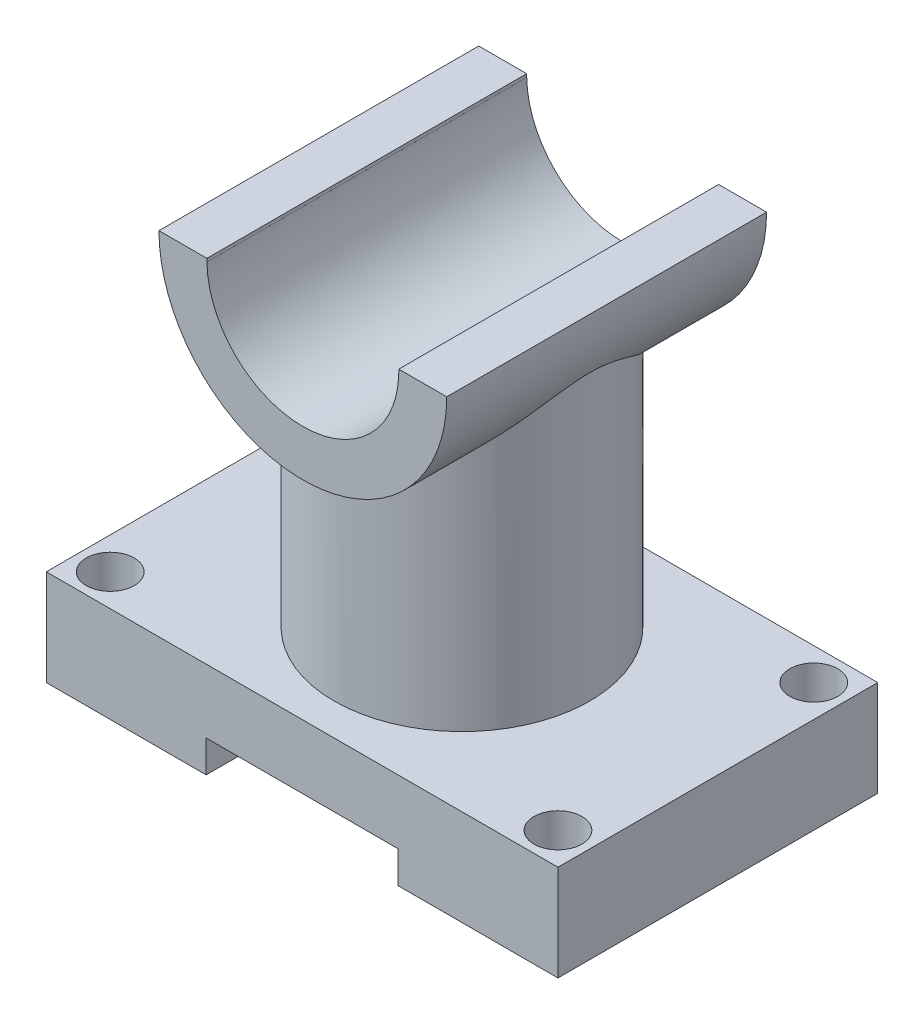
ISO-10303-21;
HEADER;
FILE_DESCRIPTION(('STEP AP214'),'2;1');
FILE_NAME('part.step','',(''),(''),'','','');
FILE_SCHEMA(('AUTOMOTIVE_DESIGN { 1 0 10303 214 1 1 1 1 }'));
ENDSEC;
DATA;
#1=APPLICATION_CONTEXT('core data for automotive mechanical design processes');
#2=APPLICATION_PROTOCOL_DEFINITION('international standard','automotive_design',2000,#1);
#3=PRODUCT_CONTEXT('',#1,'mechanical');
#4=PRODUCT('Part','Part','',(#3));
#5=PRODUCT_RELATED_PRODUCT_CATEGORY('part','',(#4));
#6=PRODUCT_DEFINITION_FORMATION('','',#4);
#7=PRODUCT_DEFINITION_CONTEXT('part definition',#1,'design');
#8=PRODUCT_DEFINITION('design','',#6,#7);
#9=PRODUCT_DEFINITION_SHAPE('','',#8);
#10=(LENGTH_UNIT() NAMED_UNIT(*) SI_UNIT(.MILLI.,.METRE.));
#11=(NAMED_UNIT(*) PLANE_ANGLE_UNIT() SI_UNIT($,.RADIAN.));
#12=(NAMED_UNIT(*) SI_UNIT($,.STERADIAN.) SOLID_ANGLE_UNIT());
#13=UNCERTAINTY_MEASURE_WITH_UNIT(LENGTH_MEASURE(1.E-05),#10,'distance_accuracy_value','');
#14=(GEOMETRIC_REPRESENTATION_CONTEXT(3) GLOBAL_UNCERTAINTY_ASSIGNED_CONTEXT((#13)) GLOBAL_UNIT_ASSIGNED_CONTEXT((#10,
#11,#12)) REPRESENTATION_CONTEXT('',''));
#15=CARTESIAN_POINT('',(0.,0.,0.));
#16=DIRECTION('',(0.,0.,1.));
#17=DIRECTION('',(1.,0.,0.));
#18=AXIS2_PLACEMENT_3D('',#15,#16,#17);
#19=CARTESIAN_POINT('',(87.1453590192644,-30.,-100.));
#20=DIRECTION('',(0.,0.,-1.));
#21=DIRECTION('',(-1.,0.,0.));
#22=AXIS2_PLACEMENT_3D('',#19,#20,#21);
#23=PLANE('',#22);
#24=DIRECTION('',(-1.,0.,0.));
#25=VECTOR('',#24,1.);
#26=CARTESIAN_POINT('',(87.1453590192644,-30.,-100.));
#27=LINE('',#26,#25);
#28=CARTESIAN_POINT('',(87.1453590192644,-30.,-100.));
#29=VERTEX_POINT('',#28);
#30=CARTESIAN_POINT('',(37.1453590192644,-30.,-100.));
#31=VERTEX_POINT('',#30);
#32=EDGE_CURVE('E180',#29,#31,#27,.T.);
#33=ORIENTED_EDGE('',*,*,#32,.T.);
#34=DIRECTION('',(0.,-1.,0.));
#35=VECTOR('',#34,1.);
#36=CARTESIAN_POINT('',(37.1453590192644,0.,-100.));
#37=LINE('',#36,#35);
#38=CARTESIAN_POINT('',(37.1453590192644,-20.,-100.));
#39=VERTEX_POINT('',#38);
#40=EDGE_CURVE('E169',#39,#31,#37,.T.);
#41=ORIENTED_EDGE('',*,*,#40,.F.);
#42=DIRECTION('',(1.,0.,0.));
#43=VECTOR('',#42,1.);
#44=CARTESIAN_POINT('',(0.,-20.,-100.));
#45=LINE('',#44,#43);
#46=CARTESIAN_POINT('',(-22.8546409807356,-20.,-100.));
#47=VERTEX_POINT('',#46);
#48=EDGE_CURVE('E158',#47,#39,#45,.T.);
#49=ORIENTED_EDGE('',*,*,#48,.F.);
#50=DIRECTION('',(0.,1.,0.));
#51=VECTOR('',#50,1.);
#52=CARTESIAN_POINT('',(-22.8546409807356,0.,-100.));
#53=LINE('',#52,#51);
#54=CARTESIAN_POINT('',(-22.8546409807356,-30.,-100.));
#55=VERTEX_POINT('',#54);
#56=EDGE_CURVE('E168',#55,#47,#53,.T.);
#57=ORIENTED_EDGE('',*,*,#56,.F.);
#58=CARTESIAN_POINT('',(-72.8546409807356,-30.,-100.));
#59=VERTEX_POINT('',#58);
#60=EDGE_CURVE('E260',#55,#59,#27,.T.);
#61=ORIENTED_EDGE('',*,*,#60,.T.);
#62=DIRECTION('',(0.,1.,0.));
#63=VECTOR('',#62,1.);
#64=CARTESIAN_POINT('',(-72.8546409807356,-30.,-100.));
#65=LINE('',#64,#63);
#66=CARTESIAN_POINT('',(-72.8546409807356,0.,-100.));
#67=VERTEX_POINT('',#66);
#68=EDGE_CURVE('E51',#59,#67,#65,.T.);
#69=ORIENTED_EDGE('',*,*,#68,.T.);
#70=DIRECTION('',(-1.,0.,0.));
#71=VECTOR('',#70,1.);
#72=CARTESIAN_POINT('',(87.1453590192644,0.,-100.));
#73=LINE('',#72,#71);
#74=CARTESIAN_POINT('',(87.1453590192644,0.,-100.));
#75=VERTEX_POINT('',#74);
#76=EDGE_CURVE('E253',#75,#67,#73,.T.);
#77=ORIENTED_EDGE('',*,*,#76,.F.);
#78=DIRECTION('',(0.,1.,0.));
#79=VECTOR('',#78,1.);
#80=CARTESIAN_POINT('',(87.1453590192644,-30.,-100.));
#81=LINE('',#80,#79);
#82=EDGE_CURVE('E275',#29,#75,#81,.T.);
#83=ORIENTED_EDGE('',*,*,#82,.F.);
#84=EDGE_LOOP('',(#33,#41,#49,#57,#61,#69,#77,#83));
#85=FACE_BOUND('',#84,.T.);
#86=ADVANCED_FACE('F37',(#85),#23,.T.);
#87=CARTESIAN_POINT('',(-72.8546409807356,-30.,0.));
#88=DIRECTION('',(0.,0.,1.));
#89=DIRECTION('',(1.,0.,0.));
#90=AXIS2_PLACEMENT_3D('',#87,#88,#89);
#91=PLANE('',#90);
#92=DIRECTION('',(1.,0.,0.));
#93=VECTOR('',#92,1.);
#94=CARTESIAN_POINT('',(0.,-20.,0.));
#95=LINE('',#94,#93);
#96=CARTESIAN_POINT('',(-22.8546409807356,-20.,0.));
#97=VERTEX_POINT('',#96);
#98=CARTESIAN_POINT('',(37.1453590192644,-20.,0.));
#99=VERTEX_POINT('',#98);
#100=EDGE_CURVE('E182',#97,#99,#95,.T.);
#101=ORIENTED_EDGE('',*,*,#100,.T.);
#102=DIRECTION('',(0.,-1.,0.));
#103=VECTOR('',#102,1.);
#104=CARTESIAN_POINT('',(37.1453590192644,0.,0.));
#105=LINE('',#104,#103);
#106=CARTESIAN_POINT('',(37.1453590192644,-30.,0.));
#107=VERTEX_POINT('',#106);
#108=EDGE_CURVE('E175',#99,#107,#105,.T.);
#109=ORIENTED_EDGE('',*,*,#108,.T.);
#110=DIRECTION('',(1.,0.,0.));
#111=VECTOR('',#110,1.);
#112=CARTESIAN_POINT('',(-72.8546409807356,-30.,0.));
#113=LINE('',#112,#111);
#114=CARTESIAN_POINT('',(87.1453590192644,-30.,0.));
#115=VERTEX_POINT('',#114);
#116=EDGE_CURVE('E252',#107,#115,#113,.T.);
#117=ORIENTED_EDGE('',*,*,#116,.T.);
#118=DIRECTION('',(0.,1.,0.));
#119=VECTOR('',#118,1.);
#120=CARTESIAN_POINT('',(87.1453590192644,-30.,0.));
#121=LINE('',#120,#119);
#122=CARTESIAN_POINT('',(87.1453590192644,0.,0.));
#123=VERTEX_POINT('',#122);
#124=EDGE_CURVE('E277',#115,#123,#121,.T.);
#125=ORIENTED_EDGE('',*,*,#124,.T.);
#126=DIRECTION('',(1.,0.,0.));
#127=VECTOR('',#126,1.);
#128=CARTESIAN_POINT('',(-72.8546409807356,0.,0.));
#129=LINE('',#128,#127);
#130=CARTESIAN_POINT('',(-72.8546409807356,0.,0.));
#131=VERTEX_POINT('',#130);
#132=EDGE_CURVE('E266',#131,#123,#129,.T.);
#133=ORIENTED_EDGE('',*,*,#132,.F.);
#134=DIRECTION('',(0.,1.,0.));
#135=VECTOR('',#134,1.);
#136=CARTESIAN_POINT('',(-72.8546409807356,-30.,0.));
#137=LINE('',#136,#135);
#138=CARTESIAN_POINT('',(-72.8546409807356,-30.,0.));
#139=VERTEX_POINT('',#138);
#140=EDGE_CURVE('E262',#139,#131,#137,.T.);
#141=ORIENTED_EDGE('',*,*,#140,.F.);
#142=CARTESIAN_POINT('',(-22.8546409807356,-30.,0.));
#143=VERTEX_POINT('',#142);
#144=EDGE_CURVE('E254',#139,#143,#113,.T.);
#145=ORIENTED_EDGE('',*,*,#144,.T.);
#146=DIRECTION('',(0.,1.,0.));
#147=VECTOR('',#146,1.);
#148=CARTESIAN_POINT('',(-22.8546409807356,0.,0.));
#149=LINE('',#148,#147);
#150=EDGE_CURVE('E59',#143,#97,#149,.T.);
#151=ORIENTED_EDGE('',*,*,#150,.T.);
#152=EDGE_LOOP('',(#101,#109,#117,#125,#133,#141,#145,#151));
#153=FACE_BOUND('',#152,.T.);
#154=ADVANCED_FACE('F285',(#153),#91,.T.);
#155=CARTESIAN_POINT('',(0.,-30.,0.));
#156=DIRECTION('',(0.,1.,0.));
#157=DIRECTION('',(0.,0.,1.));
#158=AXIS2_PLACEMENT_3D('',#155,#156,#157);
#159=PLANE('',#158);
#160=CARTESIAN_POINT('',(77.1453590192644,-30.,-10.));
#161=DIRECTION('',(0.,1.,0.));
#162=DIRECTION('',(0.,0.,1.));
#163=AXIS2_PLACEMENT_3D('',#160,#161,#162);
#164=CIRCLE('',#163,7.50000000000001);
#165=CARTESIAN_POINT('',(77.1453590192644,-30.,-2.49999999999999));
#166=VERTEX_POINT('',#165);
#167=EDGE_CURVE('E185',#166,#166,#164,.T.);
#168=ORIENTED_EDGE('',*,*,#167,.T.);
#169=EDGE_LOOP('',(#168));
#170=FACE_BOUND('',#169,.T.);
#171=CARTESIAN_POINT('',(77.1453590192644,-30.,-90.));
#172=DIRECTION('',(0.,1.,0.));
#173=DIRECTION('',(0.,0.,1.));
#174=AXIS2_PLACEMENT_3D('',#171,#172,#173);
#175=CIRCLE('',#174,7.50000000000001);
#176=CARTESIAN_POINT('',(77.1453590192644,-30.,-82.5));
#177=VERTEX_POINT('',#176);
#178=EDGE_CURVE('E387',#177,#177,#175,.T.);
#179=ORIENTED_EDGE('',*,*,#178,.T.);
#180=EDGE_LOOP('',(#179));
#181=FACE_BOUND('',#180,.T.);
#182=DIRECTION('',(0.,0.,1.));
#183=VECTOR('',#182,1.);
#184=CARTESIAN_POINT('',(37.1453590192644,-30.,-100.));
#185=LINE('',#184,#183);
#186=EDGE_CURVE('E191',#31,#107,#185,.T.);
#187=ORIENTED_EDGE('',*,*,#186,.F.);
#188=ORIENTED_EDGE('',*,*,#32,.F.);
#189=DIRECTION('',(0.,0.,-1.));
#190=VECTOR('',#189,1.);
#191=CARTESIAN_POINT('',(87.1453590192644,-30.,0.));
#192=LINE('',#191,#190);
#193=EDGE_CURVE('E257',#115,#29,#192,.T.);
#194=ORIENTED_EDGE('',*,*,#193,.F.);
#195=ORIENTED_EDGE('',*,*,#116,.F.);
#196=EDGE_LOOP('',(#187,#188,#194,#195));
#197=FACE_BOUND('',#196,.T.);
#198=ADVANCED_FACE('F297',(#170,#181,#197),#159,.F.);
#199=CARTESIAN_POINT('',(-62.8546409807356,-30.,-9.99999999999999));
#200=DIRECTION('',(0.,1.,0.));
#201=DIRECTION('',(0.,0.,1.));
#202=AXIS2_PLACEMENT_3D('',#199,#200,#201);
#203=CIRCLE('',#202,7.5);
#204=CARTESIAN_POINT('',(-62.8546409807356,-30.,-2.5));
#205=VERTEX_POINT('',#204);
#206=EDGE_CURVE('E386',#205,#205,#203,.T.);
#207=ORIENTED_EDGE('',*,*,#206,.T.);
#208=EDGE_LOOP('',(#207));
#209=FACE_BOUND('',#208,.T.);
#210=CARTESIAN_POINT('',(-62.8546409807356,-30.,-90.));
#211=DIRECTION('',(0.,1.,0.));
#212=DIRECTION('',(0.,0.,1.));
#213=AXIS2_PLACEMENT_3D('',#210,#211,#212);
#214=CIRCLE('',#213,7.5);
#215=CARTESIAN_POINT('',(-62.8546409807356,-30.,-82.5));
#216=VERTEX_POINT('',#215);
#217=EDGE_CURVE('E384',#216,#216,#214,.T.);
#218=ORIENTED_EDGE('',*,*,#217,.T.);
#219=EDGE_LOOP('',(#218));
#220=FACE_BOUND('',#219,.T.);
#221=DIRECTION('',(0.,0.,1.));
#222=VECTOR('',#221,1.);
#223=CARTESIAN_POINT('',(-22.8546409807356,-30.,-100.));
#224=LINE('',#223,#222);
#225=EDGE_CURVE('E194',#55,#143,#224,.T.);
#226=ORIENTED_EDGE('',*,*,#225,.T.);
#227=ORIENTED_EDGE('',*,*,#144,.F.);
#228=DIRECTION('',(0.,0.,1.));
#229=VECTOR('',#228,1.);
#230=CARTESIAN_POINT('',(-72.8546409807356,-30.,-100.));
#231=LINE('',#230,#229);
#232=EDGE_CURVE('E249',#59,#139,#231,.T.);
#233=ORIENTED_EDGE('',*,*,#232,.F.);
#234=ORIENTED_EDGE('',*,*,#60,.F.);
#235=EDGE_LOOP('',(#226,#227,#233,#234));
#236=FACE_BOUND('',#235,.T.);
#237=ADVANCED_FACE('F293',(#209,#220,#236),#159,.F.);
#238=CARTESIAN_POINT('',(7.37964643317979,109.466218225914,-100.));
#239=DIRECTION('',(0.,0.,1.));
#240=DIRECTION('',(1.,0.,0.));
#241=AXIS2_PLACEMENT_3D('',#238,#239,#240);
#242=CYLINDRICAL_SURFACE('',#241,30.);
#243=DIRECTION('',(0.,0.,1.));
#244=VECTOR('',#243,1.);
#245=CARTESIAN_POINT('',(-22.6167306908301,109.,-100.));
#246=LINE('',#245,#244);
#247=CARTESIAN_POINT('',(-22.6167306908301,109.,0.));
#248=VERTEX_POINT('',#247);
#249=CARTESIAN_POINT('',(-22.6167306908301,109.,-100.));
#250=VERTEX_POINT('',#249);
#251=EDGE_CURVE('E222',#248,#250,#246,.F.);
#252=ORIENTED_EDGE('',*,*,#251,.F.);
#253=CARTESIAN_POINT('',(7.37964643317979,109.466218225914,0.));
#254=DIRECTION('',(0.,0.,1.));
#255=DIRECTION('',(1.,0.,0.));
#256=AXIS2_PLACEMENT_3D('',#253,#254,#255);
#257=CIRCLE('',#256,30.);
#258=CARTESIAN_POINT('',(37.3760235571897,109.,0.));
#259=VERTEX_POINT('',#258);
#260=EDGE_CURVE('E224',#248,#259,#257,.T.);
#261=ORIENTED_EDGE('',*,*,#260,.T.);
#262=DIRECTION('',(0.,0.,1.));
#263=VECTOR('',#262,1.);
#264=CARTESIAN_POINT('',(37.3760235571897,109.,-100.));
#265=LINE('',#264,#263);
#266=CARTESIAN_POINT('',(37.3760235571897,109.,-100.));
#267=VERTEX_POINT('',#266);
#268=EDGE_CURVE('E215',#267,#259,#265,.T.);
#269=ORIENTED_EDGE('',*,*,#268,.F.);
#270=CARTESIAN_POINT('',(7.37964643317979,109.466218225914,-100.));
#271=DIRECTION('',(0.,0.,1.));
#272=DIRECTION('',(1.,0.,0.));
#273=AXIS2_PLACEMENT_3D('',#270,#271,#272);
#274=CIRCLE('',#273,30.);
#275=EDGE_CURVE('E225',#250,#267,#274,.T.);
#276=ORIENTED_EDGE('',*,*,#275,.F.);
#277=EDGE_LOOP('',(#252,#261,#269,#276));
#278=FACE_BOUND('',#277,.T.);
#279=ADVANCED_FACE('F338',(#278),#242,.F.);
#280=CARTESIAN_POINT('',(7.37964643317979,110.,-100.));
#281=DIRECTION('',(0.,0.,1.));
#282=DIRECTION('',(1.,0.,0.));
#283=AXIS2_PLACEMENT_3D('',#280,#281,#282);
#284=PLANE('',#283);
#285=DIRECTION('',(-1.,0.,0.));
#286=VECTOR('',#285,1.);
#287=CARTESIAN_POINT('',(0.,109.,-100.));
#288=LINE('',#287,#286);
#289=CARTESIAN_POINT('',(37.3796464331798,109.,-100.));
#290=VERTEX_POINT('',#289);
#291=EDGE_CURVE('E204',#290,#267,#288,.T.);
#292=ORIENTED_EDGE('',*,*,#291,.F.);
#293=DIRECTION('',(0.,1.,0.));
#294=VECTOR('',#293,1.);
#295=CARTESIAN_POINT('',(37.3796464331798,109.,-100.));
#296=LINE('',#295,#294);
#297=CARTESIAN_POINT('',(37.3796464331798,110.,-100.));
#298=VERTEX_POINT('',#297);
#299=EDGE_CURVE('E217',#290,#298,#296,.T.);
#300=ORIENTED_EDGE('',*,*,#299,.T.);
#301=DIRECTION('',(-1.,0.,0.));
#302=VECTOR('',#301,1.);
#303=CARTESIAN_POINT('',(-37.6203535668202,110.,-100.));
#304=LINE('',#303,#302);
#305=CARTESIAN_POINT('',(52.3796464331798,110.,-100.));
#306=VERTEX_POINT('',#305);
#307=EDGE_CURVE('E236',#306,#298,#304,.T.);
#308=ORIENTED_EDGE('',*,*,#307,.F.);
#309=CARTESIAN_POINT('',(7.37964643317979,110.,-100.));
#310=DIRECTION('',(0.,0.,1.));
#311=DIRECTION('',(1.,0.,0.));
#312=AXIS2_PLACEMENT_3D('',#309,#310,#311);
#313=CIRCLE('',#312,45.);
#314=CARTESIAN_POINT('',(-37.6203535668202,110.,-100.));
#315=VERTEX_POINT('',#314);
#316=EDGE_CURVE('E231',#315,#306,#313,.T.);
#317=ORIENTED_EDGE('',*,*,#316,.F.);
#318=CARTESIAN_POINT('',(-22.6203535668202,110.,-100.));
#319=VERTEX_POINT('',#318);
#320=EDGE_CURVE('E234',#319,#315,#304,.T.);
#321=ORIENTED_EDGE('',*,*,#320,.F.);
#322=DIRECTION('',(0.,1.,0.));
#323=VECTOR('',#322,1.);
#324=CARTESIAN_POINT('',(-22.6203535668202,109.,-100.));
#325=LINE('',#324,#323);
#326=CARTESIAN_POINT('',(-22.6203535668202,109.,-100.));
#327=VERTEX_POINT('',#326);
#328=EDGE_CURVE('E67',#327,#319,#325,.T.);
#329=ORIENTED_EDGE('',*,*,#328,.F.);
#330=EDGE_CURVE('E203',#250,#327,#288,.T.);
#331=ORIENTED_EDGE('',*,*,#330,.F.);
#332=ORIENTED_EDGE('',*,*,#275,.T.);
#333=EDGE_LOOP('',(#292,#300,#308,#317,#321,#329,#331,#332));
#334=FACE_BOUND('',#333,.T.);
#335=ADVANCED_FACE('F334',(#334),#284,.F.);
#336=CARTESIAN_POINT('',(7.37964643317979,110.,0.));
#337=DIRECTION('',(0.,0.,1.));
#338=DIRECTION('',(1.,0.,0.));
#339=AXIS2_PLACEMENT_3D('',#336,#337,#338);
#340=PLANE('',#339);
#341=DIRECTION('',(-1.,0.,0.));
#342=VECTOR('',#341,1.);
#343=CARTESIAN_POINT('',(-37.6203535668202,110.,0.));
#344=LINE('',#343,#342);
#345=CARTESIAN_POINT('',(52.3796464331798,110.,0.));
#346=VERTEX_POINT('',#345);
#347=CARTESIAN_POINT('',(37.3796464331798,110.,0.));
#348=VERTEX_POINT('',#347);
#349=EDGE_CURVE('E235',#346,#348,#344,.T.);
#350=ORIENTED_EDGE('',*,*,#349,.T.);
#351=DIRECTION('',(0.,1.,0.));
#352=VECTOR('',#351,1.);
#353=CARTESIAN_POINT('',(37.3796464331798,109.,0.));
#354=LINE('',#353,#352);
#355=CARTESIAN_POINT('',(37.3796464331798,109.,0.));
#356=VERTEX_POINT('',#355);
#357=EDGE_CURVE('E208',#356,#348,#354,.T.);
#358=ORIENTED_EDGE('',*,*,#357,.F.);
#359=DIRECTION('',(1.,0.,0.));
#360=VECTOR('',#359,1.);
#361=CARTESIAN_POINT('',(0.,109.,0.));
#362=LINE('',#361,#360);
#363=EDGE_CURVE('E200',#259,#356,#362,.T.);
#364=ORIENTED_EDGE('',*,*,#363,.F.);
#365=ORIENTED_EDGE('',*,*,#260,.F.);
#366=CARTESIAN_POINT('',(-22.6203535668202,109.,0.));
#367=VERTEX_POINT('',#366);
#368=EDGE_CURVE('E197',#367,#248,#362,.T.);
#369=ORIENTED_EDGE('',*,*,#368,.F.);
#370=DIRECTION('',(0.,1.,0.));
#371=VECTOR('',#370,1.);
#372=CARTESIAN_POINT('',(-22.6203535668202,109.,0.));
#373=LINE('',#372,#371);
#374=CARTESIAN_POINT('',(-22.6203535668202,110.,0.));
#375=VERTEX_POINT('',#374);
#376=EDGE_CURVE('E212',#367,#375,#373,.T.);
#377=ORIENTED_EDGE('',*,*,#376,.T.);
#378=CARTESIAN_POINT('',(-37.6203535668202,110.,0.));
#379=VERTEX_POINT('',#378);
#380=EDGE_CURVE('E242',#375,#379,#344,.T.);
#381=ORIENTED_EDGE('',*,*,#380,.T.);
#382=CARTESIAN_POINT('',(7.37964643317979,110.,0.));
#383=DIRECTION('',(0.,0.,1.));
#384=DIRECTION('',(1.,0.,0.));
#385=AXIS2_PLACEMENT_3D('',#382,#383,#384);
#386=CIRCLE('',#385,45.);
#387=EDGE_CURVE('E228',#379,#346,#386,.T.);
#388=ORIENTED_EDGE('',*,*,#387,.T.);
#389=EDGE_LOOP('',(#350,#358,#364,#365,#369,#377,#381,#388));
#390=FACE_BOUND('',#389,.T.);
#391=ADVANCED_FACE('F331',(#390),#340,.T.);
#392=CARTESIAN_POINT('',(7.14535901926442,110.,-50.));
#393=DIRECTION('',(0.,1.,0.));
#394=DIRECTION('',(0.,0.,1.));
#395=AXIS2_PLACEMENT_3D('',#392,#393,#394);
#396=PLANE('',#395);
#397=ORIENTED_EDGE('',*,*,#380,.F.);
#398=DIRECTION('',(0.,0.,-1.));
#399=VECTOR('',#398,1.);
#400=CARTESIAN_POINT('',(-22.6203535668202,110.,0.));
#401=LINE('',#400,#399);
#402=EDGE_CURVE('E210',#375,#319,#401,.T.);
#403=ORIENTED_EDGE('',*,*,#402,.T.);
#404=ORIENTED_EDGE('',*,*,#320,.T.);
#405=DIRECTION('',(0.,0.,1.));
#406=VECTOR('',#405,1.);
#407=CARTESIAN_POINT('',(-37.6203535668202,110.,-100.));
#408=LINE('',#407,#406);
#409=EDGE_CURVE('E245',#315,#379,#408,.T.);
#410=ORIENTED_EDGE('',*,*,#409,.T.);
#411=EDGE_LOOP('',(#397,#403,#404,#410));
#412=FACE_BOUND('',#411,.T.);
#413=ADVANCED_FACE('F309',(#412),#396,.T.);
#414=CARTESIAN_POINT('',(-72.8546409807356,-30.,-100.));
#415=DIRECTION('',(-1.,0.,0.));
#416=DIRECTION('',(0.,0.,1.));
#417=AXIS2_PLACEMENT_3D('',#414,#415,#416);
#418=PLANE('',#417);
#419=DIRECTION('',(0.,0.,1.));
#420=VECTOR('',#419,1.);
#421=CARTESIAN_POINT('',(-72.8546409807356,0.,-100.));
#422=LINE('',#421,#420);
#423=EDGE_CURVE('E263',#67,#131,#422,.T.);
#424=ORIENTED_EDGE('',*,*,#423,.F.);
#425=ORIENTED_EDGE('',*,*,#68,.F.);
#426=ORIENTED_EDGE('',*,*,#232,.T.);
#427=ORIENTED_EDGE('',*,*,#140,.T.);
#428=EDGE_LOOP('',(#424,#425,#426,#427));
#429=FACE_BOUND('',#428,.T.);
#430=ADVANCED_FACE('F39',(#429),#418,.T.);
#431=CARTESIAN_POINT('',(87.1453590192644,-30.,0.));
#432=DIRECTION('',(1.,0.,0.));
#433=DIRECTION('',(0.,0.,-1.));
#434=AXIS2_PLACEMENT_3D('',#431,#432,#433);
#435=PLANE('',#434);
#436=DIRECTION('',(0.,0.,-1.));
#437=VECTOR('',#436,1.);
#438=CARTESIAN_POINT('',(87.1453590192644,0.,0.));
#439=LINE('',#438,#437);
#440=EDGE_CURVE('E269',#123,#75,#439,.T.);
#441=ORIENTED_EDGE('',*,*,#440,.F.);
#442=ORIENTED_EDGE('',*,*,#124,.F.);
#443=ORIENTED_EDGE('',*,*,#193,.T.);
#444=ORIENTED_EDGE('',*,*,#82,.T.);
#445=EDGE_LOOP('',(#441,#442,#443,#444));
#446=FACE_BOUND('',#445,.T.);
#447=ADVANCED_FACE('F299',(#446),#435,.T.);
#448=CARTESIAN_POINT('',(0.,0.,0.));
#449=DIRECTION('',(0.,1.,0.));
#450=DIRECTION('',(0.,0.,1.));
#451=AXIS2_PLACEMENT_3D('',#448,#449,#450);
#452=PLANE('',#451);
#453=CARTESIAN_POINT('',(77.1453590192644,0.,-10.));
#454=DIRECTION('',(0.,1.,0.));
#455=DIRECTION('',(0.,0.,1.));
#456=AXIS2_PLACEMENT_3D('',#453,#454,#455);
#457=CIRCLE('',#456,7.50000000000001);
#458=CARTESIAN_POINT('',(77.1453590192644,0.,-2.49999999999999));
#459=VERTEX_POINT('',#458);
#460=EDGE_CURVE('E396',#459,#459,#457,.T.);
#461=ORIENTED_EDGE('',*,*,#460,.F.);
#462=EDGE_LOOP('',(#461));
#463=FACE_BOUND('',#462,.T.);
#464=CARTESIAN_POINT('',(-62.8546409807356,0.,-9.99999999999999));
#465=DIRECTION('',(0.,1.,0.));
#466=DIRECTION('',(0.,0.,1.));
#467=AXIS2_PLACEMENT_3D('',#464,#465,#466);
#468=CIRCLE('',#467,7.5);
#469=CARTESIAN_POINT('',(-62.8546409807356,0.,-2.5));
#470=VERTEX_POINT('',#469);
#471=EDGE_CURVE('E399',#470,#470,#468,.T.);
#472=ORIENTED_EDGE('',*,*,#471,.F.);
#473=EDGE_LOOP('',(#472));
#474=FACE_BOUND('',#473,.T.);
#475=CARTESIAN_POINT('',(-62.8546409807356,0.,-90.));
#476=DIRECTION('',(0.,1.,0.));
#477=DIRECTION('',(0.,0.,1.));
#478=AXIS2_PLACEMENT_3D('',#475,#476,#477);
#479=CIRCLE('',#478,7.5);
#480=CARTESIAN_POINT('',(-62.8546409807356,0.,-82.5));
#481=VERTEX_POINT('',#480);
#482=EDGE_CURVE('E381',#481,#481,#479,.T.);
#483=ORIENTED_EDGE('',*,*,#482,.F.);
#484=EDGE_LOOP('',(#483));
#485=FACE_BOUND('',#484,.T.);
#486=CARTESIAN_POINT('',(77.1453590192644,0.,-90.));
#487=DIRECTION('',(0.,1.,0.));
#488=DIRECTION('',(0.,0.,1.));
#489=AXIS2_PLACEMENT_3D('',#486,#487,#488);
#490=CIRCLE('',#489,7.50000000000001);
#491=CARTESIAN_POINT('',(77.1453590192644,0.,-82.5));
#492=VERTEX_POINT('',#491);
#493=EDGE_CURVE('E391',#492,#492,#490,.T.);
#494=ORIENTED_EDGE('',*,*,#493,.F.);
#495=EDGE_LOOP('',(#494));
#496=FACE_BOUND('',#495,.T.);
#497=CARTESIAN_POINT('',(7.14535901926442,0.,-50.));
#498=DIRECTION('',(0.,1.,0.));
#499=DIRECTION('',(0.,0.,1.));
#500=AXIS2_PLACEMENT_3D('',#497,#498,#499);
#501=CIRCLE('',#500,40.);
#502=CARTESIAN_POINT('',(7.14535901926442,0.,-10.));
#503=VERTEX_POINT('',#502);
#504=EDGE_CURVE('E11',#503,#503,#501,.T.);
#505=ORIENTED_EDGE('',*,*,#504,.F.);
#506=EDGE_LOOP('',(#505));
#507=FACE_BOUND('',#506,.T.);
#508=ORIENTED_EDGE('',*,*,#423,.T.);
#509=ORIENTED_EDGE('',*,*,#132,.T.);
#510=ORIENTED_EDGE('',*,*,#440,.T.);
#511=ORIENTED_EDGE('',*,*,#76,.T.);
#512=EDGE_LOOP('',(#508,#509,#510,#511));
#513=FACE_BOUND('',#512,.T.);
#514=ADVANCED_FACE('F289',(#463,#474,#485,#496,#507,#513),#452,.T.);
#515=CARTESIAN_POINT('',(7.14535901926442,110.,-50.));
#516=DIRECTION('',(0.,-1.,0.));
#517=DIRECTION('',(0.,0.,-1.));
#518=AXIS2_PLACEMENT_3D('',#515,#516,#517);
#519=CYLINDRICAL_SURFACE('',#518,40.);
#520=CARTESIAN_POINT('',(7.14535901926442,65.0006098996033,-90.));
#521=CARTESIAN_POINT('',(8.07387454998364,64.9957865604382,-89.999988848967));
#522=CARTESIAN_POINT('',(9.00277448540038,65.0197459960789,-89.9676023743703));
#523=CARTESIAN_POINT('',(10.8532634440663,65.1246855025931,-89.838582946139));
#524=CARTESIAN_POINT('',(11.7748477470392,65.2056997726571,-89.7419114614194));
#525=CARTESIAN_POINT('',(13.6046626786173,65.4231025036149,-89.4858531605829));
#526=CARTESIAN_POINT('',(14.5128603440771,65.5596096214038,-89.3263319795512));
#527=CARTESIAN_POINT('',(16.3069109035961,65.8849781547857,-88.9474848430448));
#528=CARTESIAN_POINT('',(17.1927666501319,66.0738328496725,-88.7281665647508));
#529=CARTESIAN_POINT('',(18.9305459348928,66.4986045746642,-88.2350574625134));
#530=CARTESIAN_POINT('',(19.7826614518774,66.7341878326821,-87.9616529994578));
#531=CARTESIAN_POINT('',(21.4549681750965,67.2489668264397,-87.3634022998871));
#532=CARTESIAN_POINT('',(22.2751590534907,67.5281630099014,-87.0385555352747));
#533=CARTESIAN_POINT('',(23.8801039396015,68.125568194275,-86.3416241784319));
#534=CARTESIAN_POINT('',(24.664867046467,68.4437670989586,-85.9695518101199));
#535=CARTESIAN_POINT('',(26.1971152262694,69.1147638598623,-85.1819951327497));
#536=CARTESIAN_POINT('',(26.9445919717654,69.4675693933102,-84.766501189589));
#537=CARTESIAN_POINT('',(28.1781953888976,70.0908353513251,-84.0289137819265));
#538=CARTESIAN_POINT('',(28.6744293106827,70.3535431888953,-83.7170424481537));
#539=CARTESIAN_POINT('',(29.6477236262516,70.8919190213972,-83.0754177610907));
#540=CARTESIAN_POINT('',(30.124788024155,71.1675842834118,-82.7456681763627));
#541=CARTESIAN_POINT('',(31.5274778287544,72.0121920430078,-81.7308163708474));
#542=CARTESIAN_POINT('',(32.4243887593369,72.5986387649361,-81.0202380948437));
#543=CARTESIAN_POINT('',(34.1426460608555,73.8081694226873,-79.5370629774724));
#544=CARTESIAN_POINT('',(34.9638171213901,74.4313331434008,-78.7643296378906));
#545=CARTESIAN_POINT('',(36.5289985307884,75.7023130628575,-77.1634812313411));
#546=CARTESIAN_POINT('',(37.2730189422256,76.3501260315548,-76.3353734099668));
#547=CARTESIAN_POINT('',(38.7006539392818,77.6741200351846,-74.6078666227483));
#548=CARTESIAN_POINT('',(39.3825618705787,78.3506115773506,-73.7072935018103));
#549=CARTESIAN_POINT('',(40.3462780253174,79.3663663289621,-72.3162947798041));
#550=CARTESIAN_POINT('',(40.6577286986655,79.705204592553,-71.8458175948771));
#551=CARTESIAN_POINT('',(41.260913051817,80.3813423481678,-70.8913317532335));
#552=CARTESIAN_POINT('',(41.5526482754146,80.718641958741,-70.4073241602044));
#553=CARTESIAN_POINT('',(42.115855628428,81.3890387342783,-69.4263654682459));
#554=CARTESIAN_POINT('',(42.3873626763262,81.7221422756479,-68.9294387703542));
#555=CARTESIAN_POINT('',(42.9105455278081,82.3823861167854,-67.9213270939972));
#556=CARTESIAN_POINT('',(43.1622204148668,82.7095261404183,-67.4101414580447));
#557=CARTESIAN_POINT('',(43.645294969195,83.3548304303606,-66.3731991530148));
#558=CARTESIAN_POINT('',(43.8767064605008,83.6729998566741,-65.8474512202598));
#559=CARTESIAN_POINT('',(44.3189254966175,84.2971615793841,-64.780374342501));
#560=CARTESIAN_POINT('',(44.5297361389557,84.6031557023353,-64.2390477557849));
#561=CARTESIAN_POINT('',(44.9360153335002,85.2077503426194,-63.123602829582));
#562=CARTESIAN_POINT('',(45.1308479967016,85.5058666043263,-62.5489882278036));
#563=CARTESIAN_POINT('',(45.4969239618527,86.0795293980552,-61.3812060634476));
#564=CARTESIAN_POINT('',(45.6681682848091,86.3550769067424,-60.7880393052532));
#565=CARTESIAN_POINT('',(45.9854381374518,86.8767229688995,-59.5831045397247));
#566=CARTESIAN_POINT('',(46.1314940587539,87.1228569002306,-58.9713600114465));
#567=CARTESIAN_POINT('',(46.3967693086633,87.578277471298,-57.7285352277804));
#568=CARTESIAN_POINT('',(46.5159932093236,87.7875703872479,-57.0974582873989));
#569=CARTESIAN_POINT('',(46.7082705652138,88.1301255039001,-55.9220134453053));
#570=CARTESIAN_POINT('',(46.7856872140579,88.2702253837112,-55.3803629609262));
#571=CARTESIAN_POINT('',(46.9188728929514,88.5135186432942,-54.286161127913));
#572=CARTESIAN_POINT('',(46.9746444485754,88.6167163287466,-53.7336110589658));
#573=CARTESIAN_POINT('',(47.0632574763258,88.781615329937,-52.6214391736587));
#574=CARTESIAN_POINT('',(47.0961387126034,88.8433885996289,-52.0618313487532));
#575=CARTESIAN_POINT('',(47.1382944965784,88.9227142621005,-50.9385694106549));
#576=CARTESIAN_POINT('',(47.1475696500157,88.9402677895734,-50.3749154016609));
#577=CARTESIAN_POINT('',(47.1422550494917,88.9302353428544,-49.2470175556719));
#578=CARTESIAN_POINT('',(47.1276182918694,88.9025604631111,-48.6827747410498));
#579=CARTESIAN_POINT('',(47.0747894975229,88.8033324849353,-47.5593214327343));
#580=CARTESIAN_POINT('',(47.0365967678185,88.7317780956358,-47.0001110875794));
#581=CARTESIAN_POINT('',(46.9375095314448,88.5480471332667,-45.8894995720136));
#582=CARTESIAN_POINT('',(46.8765745649008,88.4357981722343,-45.3381141483452));
#583=CARTESIAN_POINT('',(46.7332818957292,88.1753942745181,-44.2467871946977));
#584=CARTESIAN_POINT('',(46.6509210468405,88.0272340647031,-43.7068473580377));
#585=CARTESIAN_POINT('',(46.4166475940536,87.6126050227873,-42.3542949856975));
#586=CARTESIAN_POINT('',(46.2511033470353,87.3252586518392,-41.5504258103931));
#587=CARTESIAN_POINT('',(45.8771310048117,86.6959756677348,-39.9746978592097));
#588=CARTESIAN_POINT('',(45.6686756608355,86.354004398547,-39.2028597993136));
#589=CARTESIAN_POINT('',(45.2115293089073,85.6292616106401,-37.6876075674463));
#590=CARTESIAN_POINT('',(44.9627002797781,85.2463517278837,-36.9443021159905));
#591=CARTESIAN_POINT('',(44.4276997244241,84.4525762412504,-35.4869153815917));
#592=CARTESIAN_POINT('',(44.1415317043372,84.0417132639053,-34.772831363011));
#593=CARTESIAN_POINT('',(43.5792375891208,83.2645583739862,-33.4775082844995));
#594=CARTESIAN_POINT('',(43.3081185754853,82.9009027509157,-32.8924898341764));
#595=CARTESIAN_POINT('',(42.7404999099006,82.1642990531385,-31.740806566453));
#596=CARTESIAN_POINT('',(42.4439971136679,81.7913498313037,-31.1741440348142));
#597=CARTESIAN_POINT('',(41.825766748658,81.0396513839677,-30.058174248555));
#598=CARTESIAN_POINT('',(41.5040251608255,80.6608990304125,-29.5088768805976));
#599=CARTESIAN_POINT('',(40.8355925599697,79.9009003527216,-28.4275135258818));
#600=CARTESIAN_POINT('',(40.488902595921,79.5196541340545,-27.895446816009));
#601=CARTESIAN_POINT('',(39.7707723032544,78.7575789665824,-26.8486504647498));
#602=CARTESIAN_POINT('',(39.3993483517183,78.3767499080849,-26.3339096847266));
#603=CARTESIAN_POINT('',(38.6314865298899,77.6176880599861,-25.3215197325243));
#604=CARTESIAN_POINT('',(38.2350481296786,77.2394553255751,-24.8238709227755));
#605=CARTESIAN_POINT('',(37.0082824663738,76.1123029772477,-23.3573576530613));
#606=CARTESIAN_POINT('',(36.140027526226,75.370416305464,-22.4142295296119));
#607=CARTESIAN_POINT('',(34.489828002679,74.0708347374998,-20.7881343206171));
#608=CARTESIAN_POINT('',(33.7265587569133,73.5065052383417,-20.0914132439867));
#609=CARTESIAN_POINT('',(32.13501536351,72.4086997586465,-18.749394454451));
#610=CARTESIAN_POINT('',(31.3067410729242,71.8752238459621,-18.104096854634));
#611=CARTESIAN_POINT('',(29.5868760626423,70.848491783504,-16.8715246522501));
#612=CARTESIAN_POINT('',(28.6953840939632,70.3551753826541,-16.2841628378693));
#613=CARTESIAN_POINT('',(26.8494636449182,69.4167839205299,-15.1731732002414));
#614=CARTESIAN_POINT('',(25.8950497604975,68.9716977342204,-14.6495306757265));
#615=CARTESIAN_POINT('',(24.1260790959586,68.2234128008031,-13.772628826017));
#616=CARTESIAN_POINT('',(23.3223870121459,67.9097407693656,-13.4063477855239));
#617=CARTESIAN_POINT('',(21.6796177838602,67.3236480254581,-12.723381700791));
#618=CARTESIAN_POINT('',(20.8405446161938,67.0512226926086,-12.4066911013849));
#619=CARTESIAN_POINT('',(19.1309805545214,66.5523460014024,-11.8272469345896));
#620=CARTESIAN_POINT('',(18.2605015248137,66.3258774915947,-11.5644732445737));
#621=CARTESIAN_POINT('',(16.4927009414458,65.9230907258073,-11.096747795295));
#622=CARTESIAN_POINT('',(15.5953790757047,65.7467730531432,-10.8917967085801));
#623=CARTESIAN_POINT('',(13.7743748640192,65.4470646720061,-10.542162870153));
#624=CARTESIAN_POINT('',(12.8505635894233,65.3240088403445,-10.3978616057141));
#625=CARTESIAN_POINT('',(10.9892683579616,65.135252889308,-10.1740928212247));
#626=CARTESIAN_POINT('',(10.0517843707606,65.0695528972061,-10.0946254450411));
#627=CARTESIAN_POINT('',(8.17152141268479,64.997135060904,-10.0020908062084));
#628=CARTESIAN_POINT('',(7.22874397951989,64.9904008931467,-9.98900516747111));
#629=CARTESIAN_POINT('',(5.3461040905521,65.0361130070437,-10.0293982601243));
#630=CARTESIAN_POINT('',(4.40624143488076,65.0885551367499,-10.082872321557));
#631=CARTESIAN_POINT('',(2.62971867188619,65.2433983296583,-10.2467006640959));
#632=CARTESIAN_POINT('',(1.79200648990029,65.3403736112545,-10.3509378751936));
#633=CARTESIAN_POINT('',(0.131254033702031,65.5796832269499,-10.6108055990654));
#634=CARTESIAN_POINT('',(-0.691787405754827,65.7220139415255,-10.7664320108359));
#635=CARTESIAN_POINT('',(-2.3183933622021,66.0496130320401,-11.1267251354685));
#636=CARTESIAN_POINT('',(-3.12195561349792,66.2348863765724,-11.3313975231927));
#637=CARTESIAN_POINT('',(-4.70540066771834,66.645407010631,-11.7869350365067));
#638=CARTESIAN_POINT('',(-5.48528205479758,66.8706566847959,-12.0378029177497));
#639=CARTESIAN_POINT('',(-7.05787650413117,67.3705076357048,-12.5967881813942));
#640=CARTESIAN_POINT('',(-7.84914788748296,67.6470661687879,-12.9072042489439));
#641=CARTESIAN_POINT('',(-9.39882794377582,68.2367359230775,-13.5719770056809));
#642=CARTESIAN_POINT('',(-10.1572364307,68.5498473511506,-13.9263339435469));
#643=CARTESIAN_POINT('',(-11.6392056421088,69.2085680150922,-14.6753686319774));
#644=CARTESIAN_POINT('',(-12.3627638175415,69.5541796226752,-15.0700493253674));
#645=CARTESIAN_POINT('',(-13.7738304315692,70.2739648600935,-15.8963905662007));
#646=CARTESIAN_POINT('',(-14.4613312449712,70.6481444905647,-16.3280588851362));
#647=CARTESIAN_POINT('',(-15.6384739416357,71.3281681387061,-17.117310036705));
#648=CARTESIAN_POINT('',(-16.1359482897564,71.6288148295302,-17.4677553069034));
#649=CARTESIAN_POINT('',(-17.109342507341,72.2426100669943,-18.1868651853995));
#650=CARTESIAN_POINT('',(-17.5852658908497,72.5557565596671,-18.5555268027364));
#651=CARTESIAN_POINT('',(-18.9812079682836,73.5119530420583,-19.6876483857671));
#652=CARTESIAN_POINT('',(-19.8691172670844,74.1715958093525,-20.4770552903911));
#653=CARTESIAN_POINT('',(-21.5622947035364,75.5247434804786,-22.1204687139866));
#654=CARTESIAN_POINT('',(-22.3672538261535,76.2183617388844,-22.9746975605581));
#655=CARTESIAN_POINT('',(-23.8922237364039,77.6249329627566,-24.7407558437485));
#656=CARTESIAN_POINT('',(-24.6122528261811,78.3378817216861,-25.652572805048));
#657=CARTESIAN_POINT('',(-25.6373438800907,79.4200489390507,-27.0730335973741));
#658=CARTESIAN_POINT('',(-25.9734013333998,79.7871769944031,-27.5612181445277));
#659=CARTESIAN_POINT('',(-26.6236885725906,80.5209667785981,-28.5523243955675));
#660=CARTESIAN_POINT('',(-26.937918103524,80.8876285019449,-29.0552462714868));
#661=CARTESIAN_POINT('',(-27.544726101771,81.6184226801464,-30.0763717463162));
#662=CARTESIAN_POINT('',(-27.8372905278899,81.9825533584947,-30.5945849565689));
#663=CARTESIAN_POINT('',(-28.4004498772506,82.7054111821616,-31.6464882901083));
#664=CARTESIAN_POINT('',(-28.6710452889869,83.0641384474838,-32.1801780689056));
#665=CARTESIAN_POINT('',(-29.1890425273949,83.7717237125883,-33.2617372108235));
#666=CARTESIAN_POINT('',(-29.4365286214195,84.1206140487796,-33.8095449512841));
#667=CARTESIAN_POINT('',(-29.9090520178692,84.8062254583236,-34.9223320310519));
#668=CARTESIAN_POINT('',(-30.1340869907661,85.1429452665556,-35.4873131443496));
#669=CARTESIAN_POINT('',(-30.5607112944848,85.7991284748558,-36.6348759267259));
#670=CARTESIAN_POINT('',(-30.762329571285,86.1186129125258,-37.2174347201844));
#671=CARTESIAN_POINT('',(-31.1413482639411,86.734924618193,-38.4019574630437));
#672=CARTESIAN_POINT('',(-31.3187566712289,87.0317593482959,-39.0039149276408));
#673=CARTESIAN_POINT('',(-31.6251049187782,87.5565482191504,-40.143567969614));
#674=CARTESIAN_POINT('',(-31.7573544065504,87.7883454167974,-40.678594367999));
#675=CARTESIAN_POINT('',(-32.0015933503835,88.2243167502729,-41.7643651848727));
#676=CARTESIAN_POINT('',(-32.1135846156018,88.4284933523433,-42.3151081947011));
#677=CARTESIAN_POINT('',(-32.3155655183974,88.8024700080983,-43.4306869055443));
#678=CARTESIAN_POINT('',(-32.4056081483412,88.9723526863074,-43.9954849609266));
#679=CARTESIAN_POINT('',(-32.5623702942212,89.2716631958447,-45.1390177138578));
#680=CARTESIAN_POINT('',(-32.6290901824719,89.4010916729632,-45.717752188774));
#681=CARTESIAN_POINT('',(-32.7383821849284,89.6147467400692,-46.8949091894868));
#682=CARTESIAN_POINT('',(-32.7805792226195,89.6982702199464,-47.493496625399));
#683=CARTESIAN_POINT('',(-32.8379497023513,89.8121537875551,-48.6970086882637));
#684=CARTESIAN_POINT('',(-32.8531267254947,89.842520920364,-49.3019324647368));
#685=CARTESIAN_POINT('',(-32.8559390468827,89.8481345304278,-50.5120830971746));
#686=CARTESIAN_POINT('',(-32.8435755337115,89.8233833864566,-51.1173099389328));
#687=CARTESIAN_POINT('',(-32.7917414844323,89.7203846896297,-52.3220097876438));
#688=CARTESIAN_POINT('',(-32.7522667591521,89.6421288693427,-52.9214818908683));
#689=CARTESIAN_POINT('',(-32.6424056378936,89.426929793583,-54.1666662047587));
#690=CARTESIAN_POINT('',(-32.5694142014806,89.2850712815151,-54.8112888355947));
#691=CARTESIAN_POINT('',(-32.3945698570423,88.9513187657773,-56.0833059560862));
#692=CARTESIAN_POINT('',(-32.2927108591942,88.7594142052107,-56.7106967799003));
#693=CARTESIAN_POINT('',(-32.0620387763387,88.3340795389694,-57.9484443946662));
#694=CARTESIAN_POINT('',(-31.9331333729582,88.1005076286656,-58.558734511631));
#695=CARTESIAN_POINT('',(-31.6505975349221,87.6008397292204,-59.7598407961171));
#696=CARTESIAN_POINT('',(-31.4969657468688,87.3347419599693,-60.3506558955401));
#697=CARTESIAN_POINT('',(-31.1819809976563,86.803291833843,-61.4592931839181));
#698=CARTESIAN_POINT('',(-31.0226818112671,86.5401809620955,-61.9787866783538));
#699=CARTESIAN_POINT('',(-30.685931502398,85.9976306720152,-63.0032395413081));
#700=CARTESIAN_POINT('',(-30.5084770733952,85.7181882832932,-63.5081962407787));
#701=CARTESIAN_POINT('',(-30.1359760819106,85.1465383788592,-64.504660062588));
#702=CARTESIAN_POINT('',(-29.9409177086998,84.8543223619486,-64.9961578626347));
#703=CARTESIAN_POINT('',(-29.5337871898856,84.2603794091858,-65.9661156151623));
#704=CARTESIAN_POINT('',(-29.3217159957717,83.9586530058008,-66.4445762947784));
#705=CARTESIAN_POINT('',(-28.8805498339248,83.3477899602501,-67.3898335630361));
#706=CARTESIAN_POINT('',(-28.6514314389333,83.0386435312838,-67.8566128765415));
#707=CARTESIAN_POINT('',(-28.17661657821,82.4154801327703,-68.7783583218989));
#708=CARTESIAN_POINT('',(-27.9309188286679,82.1014627875005,-69.2333235351484));
#709=CARTESIAN_POINT('',(-27.1693207396255,81.1551784617709,-70.5807636756673));
#710=CARTESIAN_POINT('',(-26.6287013208719,80.5183791173656,-71.4562407376245));
#711=CARTESIAN_POINT('',(-25.4234232758693,79.1803589466862,-73.2498899887683));
#712=CARTESIAN_POINT('',(-24.7517426615041,78.4791671269754,-74.1633611120621));
#713=CARTESIAN_POINT('',(-23.32754028761,77.0901461636809,-75.9363691945955));
#714=CARTESIAN_POINT('',(-22.5750035861649,76.4023195177612,-76.7958961384935));
#715=CARTESIAN_POINT('',(-20.9893256632976,75.0531321551296,-78.4561943846285));
#716=CARTESIAN_POINT('',(-20.1563180453354,74.3917300626692,-79.2570593221913));
#717=CARTESIAN_POINT('',(-18.4078948489112,73.1058304359074,-80.7958862881001));
#718=CARTESIAN_POINT('',(-17.4925031586411,72.4813222902324,-81.5338664305449));
#719=CARTESIAN_POINT('',(-15.7831304039841,71.4088648013517,-82.7895833714671));
#720=CARTESIAN_POINT('',(-15.0048153427247,70.9516404307932,-83.3207519618687));
#721=CARTESIAN_POINT('',(-13.3978287676889,70.073381275952,-84.3348230369604));
#722=CARTESIAN_POINT('',(-12.5691592962628,69.652345025567,-84.8177274771226));
#723=CARTESIAN_POINT('',(-10.8632816292589,68.852922196868,-85.7298683593789));
#724=CARTESIAN_POINT('',(-9.98609238569877,68.4745191388213,-86.1591255457179));
#725=CARTESIAN_POINT('',(-8.63638102039128,67.943838070458,-86.7583886104933));
#726=CARTESIAN_POINT('',(-8.18084088498987,67.7731041778977,-86.9506992849764));
#727=CARTESIAN_POINT('',(-7.25874393409243,67.444658374957,-87.3198136525433));
#728=CARTESIAN_POINT('',(-6.79218425900958,67.2869498935139,-87.4966132630996));
#729=CARTESIAN_POINT('',(-5.52264218196246,66.8811853020889,-87.9504855453798));
#730=CARTESIAN_POINT('',(-4.71000984062667,66.6460203160963,-88.2124075254318));
#731=CARTESIAN_POINT('',(-3.05910782318641,66.2191949012146,-88.6859906953493));
#732=CARTESIAN_POINT('',(-2.22084280902386,66.0275266141413,-88.89766096409));
#733=CARTESIAN_POINT('',(-0.948807333896148,65.7753064884666,-89.1748971474594));
#734=CARTESIAN_POINT('',(-0.522755551642323,65.6971693566054,-89.2605371837598));
#735=CARTESIAN_POINT('',(0.333832133462021,65.5528963902005,-89.4181764770396));
#736=CARTESIAN_POINT('',(0.764367263191592,65.4867585215554,-89.4901780460876));
#737=CARTESIAN_POINT('',(1.62906310408877,65.3668144907133,-89.620216631812));
#738=CARTESIAN_POINT('',(2.06322225746314,65.3130032869305,-89.6782593581182));
#739=CARTESIAN_POINT('',(2.93455128050705,65.2179364721108,-89.7801648806524));
#740=CARTESIAN_POINT('',(3.37172107418731,65.1766805453548,-89.8240280334462));
#741=CARTESIAN_POINT('',(4.36344351873793,65.0977662289366,-89.9070074062493));
#742=CARTESIAN_POINT('',(4.91866808033561,65.0638988924233,-89.9418508129226));
#743=CARTESIAN_POINT('',(6.03100174244718,65.0167662993303,-89.9883524703532));
#744=CARTESIAN_POINT('',(6.58811115359089,65.0035046228107,-90.0000066922837));
#745=CARTESIAN_POINT('',(7.14535901926442,65.0006098996033,-90.));
#746=B_SPLINE_CURVE_WITH_KNOTS('',3,(#520,#521,#522,#523,#524,#525,#526,#527,#528,#529,#530,
#531,#532,#533,#534,#535,#536,#537,#538,#539,#540,#541,#542,#543,#544,#545,#546,#547,#548,#549,
#550,#551,#552,#553,#554,#555,#556,#557,#558,#559,#560,#561,#562,#563,#564,#565,#566,#567,#568,
#569,#570,#571,#572,#573,#574,#575,#576,#577,#578,#579,#580,#581,#582,#583,#584,#585,#586,#587,
#588,#589,#590,#591,#592,#593,#594,#595,#596,#597,#598,#599,#600,#601,#602,#603,#604,#605,#606,
#607,#608,#609,#610,#611,#612,#613,#614,#615,#616,#617,#618,#619,#620,#621,#622,#623,#624,#625,
#626,#627,#628,#629,#630,#631,#632,#633,#634,#635,#636,#637,#638,#639,#640,#641,#642,#643,#644,
#645,#646,#647,#648,#649,#650,#651,#652,#653,#654,#655,#656,#657,#658,#659,#660,#661,#662,#663,
#664,#665,#666,#667,#668,#669,#670,#671,#672,#673,#674,#675,#676,#677,#678,#679,#680,#681,#682,
#683,#684,#685,#686,#687,#688,#689,#690,#691,#692,#693,#694,#695,#696,#697,#698,#699,#700,#701,
#702,#703,#704,#705,#706,#707,#708,#709,#710,#711,#712,#713,#714,#715,#716,#717,#718,#719,#720,
#721,#722,#723,#724,#725,#726,#727,#728,#729,#730,#731,#732,#733,#734,#735,#736,#737,#738,#739,
#740,#741,#742,#743,#744,#745),.UNSPECIFIED.,.T.,.F.,(4,2,2,2,2,2,2,2,2,2,2,2,2,2,2,2,2,2,2,2,2,
2,2,2,2,2,2,2,2,2,2,2,2,2,2,2,2,2,2,2,2,2,2,2,2,2,2,2,2,2,2,2,2,2,2,2,2,2,2,2,2,2,2,2,2,2,2,2,2,
2,2,2,2,2,2,2,2,2,2,2,2,2,2,2,2,2,2,2,2,2,2,2,2,2,2,2,2,2,2,2,2,2,2,2,2,2,2,2,2,2,2,2,4),(0.,
2.78498918531747,5.57164914105221,8.36429924449022,11.1565909761498,13.9296130501064,
16.7026635932503,19.4749978156727,22.2479484571577,24.1741460398577,26.0999391654806,
29.9523291662453,33.813423315301,37.6740132360324,41.6202653618373,43.5943663421313,
45.5683125633144,47.5387683092321,49.5093150645906,51.4787042014492,53.4477967654246,
55.4749661748058,57.5020478118156,59.526666252275,61.5509394454213,63.2438343434811,
64.9365316531622,66.6262810890797,68.3159871650255,70.0090186956602,71.7021000350386,
73.3982079433975,75.0945650556622,77.6989121744007,80.3049181970938,82.9200284353626,
85.5348932908063,87.7549650752441,89.9753122584776,92.1969016021941,94.4183975919099,
96.6384370162513,98.8585234868507,103.295740849424,106.825296944331,110.354860801063,
113.879027749722,117.40238005727,120.211556677172,123.02041838508,125.828229867742,
128.636074007349,131.461324334254,134.286580930392,137.11105538372,139.935331677605,
142.481603209494,145.0276715908,147.574034707181,150.12054976843,152.79948833987,
155.478442073171,158.157591456214,160.837305143803,162.872802232753,164.907966214752,
168.979421185748,173.065533374035,177.150763403557,179.241863901486,181.332988819172,
183.42545734818,185.517879337113,187.602346249056,189.687029220825,191.769107200425,
193.850496236166,195.643155451031,197.435654493618,199.223781914963,201.011880790095,
202.82665395843,204.641186587553,206.455640907276,208.270375656083,210.259427547537,
212.248899356744,214.245275706781,216.241761365586,218.052192196309,219.862953340624,
221.6749385114,223.486822412398,225.3012440134,227.115806274404,230.743171387152,
234.739123107391,238.735814539444,242.725980842081,246.714993855841,249.854405613208,
252.993690122447,256.131756956871,257.700669273247,259.269993297778,261.92394809205,
264.577423036154,265.901719777947,267.225791816279,268.549321340549,269.872817580171,
271.543936339554,273.215345409297),.UNSPECIFIED.);
#747=CARTESIAN_POINT('',(7.14535901926442,65.0006098996033,-90.));
#748=VERTEX_POINT('',#747);
#749=EDGE_CURVE('E41',#748,#748,#746,.T.);
#750=ORIENTED_EDGE('',*,*,#749,.T.);
#751=EDGE_LOOP('',(#750));
#752=FACE_BOUND('',#751,.T.);
#753=ORIENTED_EDGE('',*,*,#504,.T.);
#754=EDGE_LOOP('',(#753));
#755=FACE_BOUND('',#754,.T.);
#756=ADVANCED_FACE('F306',(#752,#755),#519,.T.);
#757=CARTESIAN_POINT('',(7.37964643317979,110.,-100.));
#758=DIRECTION('',(0.,0.,1.));
#759=DIRECTION('',(1.,0.,0.));
#760=AXIS2_PLACEMENT_3D('',#757,#758,#759);
#761=CYLINDRICAL_SURFACE('',#760,45.);
#762=ORIENTED_EDGE('',*,*,#387,.F.);
#763=ORIENTED_EDGE('',*,*,#409,.F.);
#764=ORIENTED_EDGE('',*,*,#316,.T.);
#765=DIRECTION('',(0.,0.,1.));
#766=VECTOR('',#765,1.);
#767=CARTESIAN_POINT('',(52.3796464331798,110.,-100.));
#768=LINE('',#767,#766);
#769=EDGE_CURVE('E239',#306,#346,#768,.T.);
#770=ORIENTED_EDGE('',*,*,#769,.T.);
#771=EDGE_LOOP('',(#762,#763,#764,#770));
#772=FACE_BOUND('',#771,.T.);
#773=ORIENTED_EDGE('',*,*,#749,.F.);
#774=EDGE_LOOP('',(#773));
#775=FACE_BOUND('',#774,.T.);
#776=ADVANCED_FACE('F321',(#772,#775),#761,.T.);
#777=DIRECTION('',(0.,0.,-1.));
#778=VECTOR('',#777,1.);
#779=CARTESIAN_POINT('',(37.3796464331798,110.,0.));
#780=LINE('',#779,#778);
#781=EDGE_CURVE('E193',#348,#298,#780,.T.);
#782=ORIENTED_EDGE('',*,*,#781,.F.);
#783=ORIENTED_EDGE('',*,*,#349,.F.);
#784=ORIENTED_EDGE('',*,*,#769,.F.);
#785=ORIENTED_EDGE('',*,*,#307,.T.);
#786=EDGE_LOOP('',(#782,#783,#784,#785));
#787=FACE_BOUND('',#786,.T.);
#788=ADVANCED_FACE('F323',(#787),#396,.T.);
#789=CARTESIAN_POINT('',(0.,109.,0.));
#790=DIRECTION('',(0.,1.,0.));
#791=DIRECTION('',(0.,0.,1.));
#792=AXIS2_PLACEMENT_3D('',#789,#790,#791);
#793=PLANE('',#792);
#794=ORIENTED_EDGE('',*,*,#268,.T.);
#795=ORIENTED_EDGE('',*,*,#363,.T.);
#796=DIRECTION('',(0.,0.,-1.));
#797=VECTOR('',#796,1.);
#798=CARTESIAN_POINT('',(37.3796464331798,109.,0.));
#799=LINE('',#798,#797);
#800=EDGE_CURVE('E199',#356,#290,#799,.T.);
#801=ORIENTED_EDGE('',*,*,#800,.T.);
#802=ORIENTED_EDGE('',*,*,#291,.T.);
#803=EDGE_LOOP('',(#794,#795,#801,#802));
#804=FACE_BOUND('',#803,.T.);
#805=ADVANCED_FACE('F325',(#804),#793,.T.);
#806=CARTESIAN_POINT('',(37.3796464331798,109.,0.));
#807=DIRECTION('',(1.,0.,0.));
#808=DIRECTION('',(0.,0.,-1.));
#809=AXIS2_PLACEMENT_3D('',#806,#807,#808);
#810=PLANE('',#809);
#811=ORIENTED_EDGE('',*,*,#357,.T.);
#812=ORIENTED_EDGE('',*,*,#781,.T.);
#813=ORIENTED_EDGE('',*,*,#299,.F.);
#814=ORIENTED_EDGE('',*,*,#800,.F.);
#815=EDGE_LOOP('',(#811,#812,#813,#814));
#816=FACE_BOUND('',#815,.T.);
#817=ADVANCED_FACE('F343',(#816),#810,.F.);
#818=ORIENTED_EDGE('',*,*,#251,.T.);
#819=ORIENTED_EDGE('',*,*,#330,.T.);
#820=DIRECTION('',(0.,0.,-1.));
#821=VECTOR('',#820,1.);
#822=CARTESIAN_POINT('',(-22.6203535668202,109.,0.));
#823=LINE('',#822,#821);
#824=EDGE_CURVE('E206',#367,#327,#823,.T.);
#825=ORIENTED_EDGE('',*,*,#824,.F.);
#826=ORIENTED_EDGE('',*,*,#368,.T.);
#827=EDGE_LOOP('',(#818,#819,#825,#826));
#828=FACE_BOUND('',#827,.T.);
#829=ADVANCED_FACE('F346',(#828),#793,.T.);
#830=CARTESIAN_POINT('',(-22.6203535668202,109.,0.));
#831=DIRECTION('',(1.,0.,0.));
#832=DIRECTION('',(0.,0.,-1.));
#833=AXIS2_PLACEMENT_3D('',#830,#831,#832);
#834=PLANE('',#833);
#835=ORIENTED_EDGE('',*,*,#376,.F.);
#836=ORIENTED_EDGE('',*,*,#824,.T.);
#837=ORIENTED_EDGE('',*,*,#328,.T.);
#838=ORIENTED_EDGE('',*,*,#402,.F.);
#839=EDGE_LOOP('',(#835,#836,#837,#838));
#840=FACE_BOUND('',#839,.T.);
#841=ADVANCED_FACE('F348',(#840),#834,.T.);
#842=CARTESIAN_POINT('',(37.1453590192644,0.,-100.));
#843=DIRECTION('',(-1.,0.,0.));
#844=DIRECTION('',(0.,0.,1.));
#845=AXIS2_PLACEMENT_3D('',#842,#843,#844);
#846=PLANE('',#845);
#847=ORIENTED_EDGE('',*,*,#108,.F.);
#848=DIRECTION('',(0.,0.,1.));
#849=VECTOR('',#848,1.);
#850=CARTESIAN_POINT('',(37.1453590192644,-20.,-100.));
#851=LINE('',#850,#849);
#852=EDGE_CURVE('E162',#39,#99,#851,.T.);
#853=ORIENTED_EDGE('',*,*,#852,.F.);
#854=ORIENTED_EDGE('',*,*,#40,.T.);
#855=ORIENTED_EDGE('',*,*,#186,.T.);
#856=EDGE_LOOP('',(#847,#853,#854,#855));
#857=FACE_BOUND('',#856,.T.);
#858=ADVANCED_FACE('F172',(#857),#846,.T.);
#859=CARTESIAN_POINT('',(-22.8546409807356,0.,-100.));
#860=DIRECTION('',(1.,0.,0.));
#861=DIRECTION('',(0.,0.,-1.));
#862=AXIS2_PLACEMENT_3D('',#859,#860,#861);
#863=PLANE('',#862);
#864=ORIENTED_EDGE('',*,*,#150,.F.);
#865=ORIENTED_EDGE('',*,*,#225,.F.);
#866=ORIENTED_EDGE('',*,*,#56,.T.);
#867=DIRECTION('',(0.,0.,1.));
#868=VECTOR('',#867,1.);
#869=CARTESIAN_POINT('',(-22.8546409807356,-20.,-100.));
#870=LINE('',#869,#868);
#871=EDGE_CURVE('E164',#47,#97,#870,.T.);
#872=ORIENTED_EDGE('',*,*,#871,.T.);
#873=EDGE_LOOP('',(#864,#865,#866,#872));
#874=FACE_BOUND('',#873,.T.);
#875=ADVANCED_FACE('F356',(#874),#863,.T.);
#876=CARTESIAN_POINT('',(0.,-20.,-100.));
#877=DIRECTION('',(0.,-1.,0.));
#878=DIRECTION('',(0.,0.,-1.));
#879=AXIS2_PLACEMENT_3D('',#876,#877,#878);
#880=PLANE('',#879);
#881=ORIENTED_EDGE('',*,*,#100,.F.);
#882=ORIENTED_EDGE('',*,*,#871,.F.);
#883=ORIENTED_EDGE('',*,*,#48,.T.);
#884=ORIENTED_EDGE('',*,*,#852,.T.);
#885=EDGE_LOOP('',(#881,#882,#883,#884));
#886=FACE_BOUND('',#885,.T.);
#887=ADVANCED_FACE('F161',(#886),#880,.T.);
#888=CARTESIAN_POINT('',(77.1453590192644,-100.,-90.));
#889=DIRECTION('',(0.,1.,0.));
#890=DIRECTION('',(0.,0.,1.));
#891=AXIS2_PLACEMENT_3D('',#888,#889,#890);
#892=CYLINDRICAL_SURFACE('',#891,7.50000000000001);
#893=ORIENTED_EDGE('',*,*,#493,.T.);
#894=EDGE_LOOP('',(#893));
#895=FACE_BOUND('',#894,.T.);
#896=ORIENTED_EDGE('',*,*,#178,.F.);
#897=EDGE_LOOP('',(#896));
#898=FACE_BOUND('',#897,.T.);
#899=ADVANCED_FACE('F359',(#895,#898),#892,.F.);
#900=CARTESIAN_POINT('',(-62.8546409807356,-100.,-90.));
#901=DIRECTION('',(0.,1.,0.));
#902=DIRECTION('',(0.,0.,1.));
#903=AXIS2_PLACEMENT_3D('',#900,#901,#902);
#904=CYLINDRICAL_SURFACE('',#903,7.5);
#905=ORIENTED_EDGE('',*,*,#482,.T.);
#906=EDGE_LOOP('',(#905));
#907=FACE_BOUND('',#906,.T.);
#908=ORIENTED_EDGE('',*,*,#217,.F.);
#909=EDGE_LOOP('',(#908));
#910=FACE_BOUND('',#909,.T.);
#911=ADVANCED_FACE('F364',(#907,#910),#904,.F.);
#912=CARTESIAN_POINT('',(-62.8546409807356,-100.,-9.99999999999999));
#913=DIRECTION('',(0.,1.,0.));
#914=DIRECTION('',(0.,0.,1.));
#915=AXIS2_PLACEMENT_3D('',#912,#913,#914);
#916=CYLINDRICAL_SURFACE('',#915,7.5);
#917=ORIENTED_EDGE('',*,*,#471,.T.);
#918=EDGE_LOOP('',(#917));
#919=FACE_BOUND('',#918,.T.);
#920=ORIENTED_EDGE('',*,*,#206,.F.);
#921=EDGE_LOOP('',(#920));
#922=FACE_BOUND('',#921,.T.);
#923=ADVANCED_FACE('F369',(#919,#922),#916,.F.);
#924=CARTESIAN_POINT('',(77.1453590192644,-100.,-10.));
#925=DIRECTION('',(0.,1.,0.));
#926=DIRECTION('',(0.,0.,1.));
#927=AXIS2_PLACEMENT_3D('',#924,#925,#926);
#928=CYLINDRICAL_SURFACE('',#927,7.50000000000001);
#929=ORIENTED_EDGE('',*,*,#460,.T.);
#930=EDGE_LOOP('',(#929));
#931=FACE_BOUND('',#930,.T.);
#932=ORIENTED_EDGE('',*,*,#167,.F.);
#933=EDGE_LOOP('',(#932));
#934=FACE_BOUND('',#933,.T.);
#935=ADVANCED_FACE('F366',(#931,#934),#928,.F.);
#936=CLOSED_SHELL('',(#86,#154,#198,#237,#279,#335,#391,#413,#430,#447,#514,#756,#776,#788,#805,
#817,#829,#841,#858,#875,#887,#899,#911,#923,#935));
#937=MANIFOLD_SOLID_BREP('B2',#936);
#938=ADVANCED_BREP_SHAPE_REPRESENTATION('',(#18,#937),#14);
#939=SHAPE_DEFINITION_REPRESENTATION(#9,#938);
ENDSEC;
END-ISO-10303-21;
